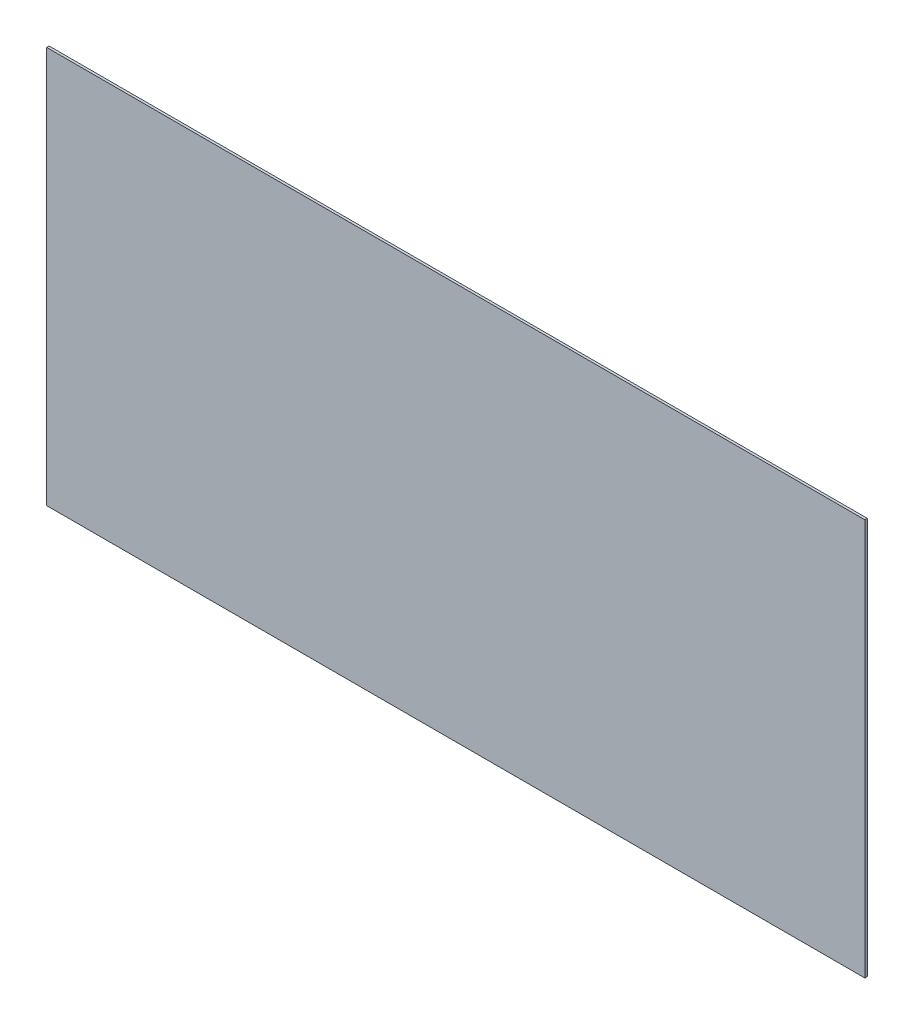
ISO-10303-21;
HEADER;
FILE_DESCRIPTION(('STEP AP214'),'2;1');
FILE_NAME('part.step','',(''),(''),'','','');
FILE_SCHEMA(('AUTOMOTIVE_DESIGN { 1 0 10303 214 1 1 1 1 }'));
ENDSEC;
DATA;
#1=APPLICATION_CONTEXT('core data for automotive mechanical design processes');
#2=APPLICATION_PROTOCOL_DEFINITION('international standard','automotive_design',2000,#1);
#3=PRODUCT_CONTEXT('',#1,'mechanical');
#4=PRODUCT('Part','Part','',(#3));
#5=PRODUCT_RELATED_PRODUCT_CATEGORY('part','',(#4));
#6=PRODUCT_DEFINITION_FORMATION('','',#4);
#7=PRODUCT_DEFINITION_CONTEXT('part definition',#1,'design');
#8=PRODUCT_DEFINITION('design','',#6,#7);
#9=PRODUCT_DEFINITION_SHAPE('','',#8);
#10=(LENGTH_UNIT() NAMED_UNIT(*) SI_UNIT(.MILLI.,.METRE.));
#11=(NAMED_UNIT(*) PLANE_ANGLE_UNIT() SI_UNIT($,.RADIAN.));
#12=(NAMED_UNIT(*) SI_UNIT($,.STERADIAN.) SOLID_ANGLE_UNIT());
#13=UNCERTAINTY_MEASURE_WITH_UNIT(LENGTH_MEASURE(1.E-05),#10,'distance_accuracy_value','');
#14=(GEOMETRIC_REPRESENTATION_CONTEXT(3) GLOBAL_UNCERTAINTY_ASSIGNED_CONTEXT((#13)) GLOBAL_UNIT_ASSIGNED_CONTEXT((#10,
#11,#12)) REPRESENTATION_CONTEXT('',''));
#15=CARTESIAN_POINT('',(0.,0.,0.));
#16=DIRECTION('',(0.,0.,1.));
#17=DIRECTION('',(1.,0.,0.));
#18=AXIS2_PLACEMENT_3D('',#15,#16,#17);
#19=CARTESIAN_POINT('',(-25.5120147874307,6.05914972273569,0.2));
#20=DIRECTION('',(1.,0.,0.));
#21=DIRECTION('',(0.,0.,-1.));
#22=AXIS2_PLACEMENT_3D('',#19,#20,#21);
#23=PLANE('',#22);
#24=DIRECTION('',(0.,-1.,0.));
#25=VECTOR('',#24,1.);
#26=CARTESIAN_POINT('',(-25.5120147874307,6.05914972273569,0.));
#27=LINE('',#26,#25);
#28=CARTESIAN_POINT('',(-25.5120147874307,6.05914972273569,0.));
#29=VERTEX_POINT('',#28);
#30=CARTESIAN_POINT('',(-25.5120147874307,-26.4408502772643,0.));
#31=VERTEX_POINT('',#30);
#32=EDGE_CURVE('E113',#29,#31,#27,.T.);
#33=ORIENTED_EDGE('',*,*,#32,.T.);
#34=DIRECTION('',(0.,0.,-1.));
#35=VECTOR('',#34,1.);
#36=CARTESIAN_POINT('',(-25.5120147874307,-26.4408502772643,0.2));
#37=LINE('',#36,#35);
#38=CARTESIAN_POINT('',(-25.5120147874307,-26.4408502772643,0.2));
#39=VERTEX_POINT('',#38);
#40=EDGE_CURVE('E11',#39,#31,#37,.T.);
#41=ORIENTED_EDGE('',*,*,#40,.F.);
#42=DIRECTION('',(0.,-1.,0.));
#43=VECTOR('',#42,1.);
#44=CARTESIAN_POINT('',(-25.5120147874307,6.05914972273569,0.2));
#45=LINE('',#44,#43);
#46=CARTESIAN_POINT('',(-25.5120147874307,6.05914972273569,0.2));
#47=VERTEX_POINT('',#46);
#48=EDGE_CURVE('E97',#47,#39,#45,.T.);
#49=ORIENTED_EDGE('',*,*,#48,.F.);
#50=DIRECTION('',(0.,0.,-1.));
#51=VECTOR('',#50,1.);
#52=CARTESIAN_POINT('',(-25.5120147874307,6.05914972273569,0.2));
#53=LINE('',#52,#51);
#54=EDGE_CURVE('E109',#47,#29,#53,.T.);
#55=ORIENTED_EDGE('',*,*,#54,.T.);
#56=EDGE_LOOP('',(#33,#41,#49,#55));
#57=FACE_BOUND('',#56,.T.);
#58=ADVANCED_FACE('F45',(#57),#23,.F.);
#59=CARTESIAN_POINT('',(-25.5120147874307,-26.4408502772643,0.2));
#60=DIRECTION('',(0.,1.,0.));
#61=DIRECTION('',(0.,0.,1.));
#62=AXIS2_PLACEMENT_3D('',#59,#60,#61);
#63=PLANE('',#62);
#64=DIRECTION('',(1.,0.,0.));
#65=VECTOR('',#64,1.);
#66=CARTESIAN_POINT('',(-25.5120147874307,-26.4408502772643,0.));
#67=LINE('',#66,#65);
#68=CARTESIAN_POINT('',(41.4879852125693,-26.4408502772643,0.));
#69=VERTEX_POINT('',#68);
#70=EDGE_CURVE('E102',#31,#69,#67,.T.);
#71=ORIENTED_EDGE('',*,*,#70,.T.);
#72=DIRECTION('',(0.,0.,-1.));
#73=VECTOR('',#72,1.);
#74=CARTESIAN_POINT('',(41.4879852125693,-26.4408502772643,0.2));
#75=LINE('',#74,#73);
#76=CARTESIAN_POINT('',(41.4879852125693,-26.4408502772643,0.2));
#77=VERTEX_POINT('',#76);
#78=EDGE_CURVE('E54',#77,#69,#75,.T.);
#79=ORIENTED_EDGE('',*,*,#78,.F.);
#80=DIRECTION('',(1.,0.,0.));
#81=VECTOR('',#80,1.);
#82=CARTESIAN_POINT('',(-25.5120147874307,-26.4408502772643,0.2));
#83=LINE('',#82,#81);
#84=EDGE_CURVE('E92',#39,#77,#83,.T.);
#85=ORIENTED_EDGE('',*,*,#84,.F.);
#86=ORIENTED_EDGE('',*,*,#40,.T.);
#87=EDGE_LOOP('',(#71,#79,#85,#86));
#88=FACE_BOUND('',#87,.T.);
#89=ADVANCED_FACE('F101',(#88),#63,.F.);
#90=CARTESIAN_POINT('',(41.4879852125693,6.05914972273569,0.2));
#91=DIRECTION('',(-1.,0.,0.));
#92=DIRECTION('',(0.,0.,1.));
#93=AXIS2_PLACEMENT_3D('',#90,#91,#92);
#94=PLANE('',#93);
#95=DIRECTION('',(0.,1.,0.));
#96=VECTOR('',#95,1.);
#97=CARTESIAN_POINT('',(41.4879852125693,6.05914972273569,0.));
#98=LINE('',#97,#96);
#99=CARTESIAN_POINT('',(41.4879852125693,6.05914972273569,0.));
#100=VERTEX_POINT('',#99);
#101=EDGE_CURVE('E79',#69,#100,#98,.T.);
#102=ORIENTED_EDGE('',*,*,#101,.T.);
#103=DIRECTION('',(0.,0.,-1.));
#104=VECTOR('',#103,1.);
#105=CARTESIAN_POINT('',(41.4879852125693,6.05914972273569,0.2));
#106=LINE('',#105,#104);
#107=CARTESIAN_POINT('',(41.4879852125693,6.05914972273569,0.2));
#108=VERTEX_POINT('',#107);
#109=EDGE_CURVE('E104',#108,#100,#106,.T.);
#110=ORIENTED_EDGE('',*,*,#109,.F.);
#111=DIRECTION('',(0.,1.,0.));
#112=VECTOR('',#111,1.);
#113=CARTESIAN_POINT('',(41.4879852125693,6.05914972273569,0.2));
#114=LINE('',#113,#112);
#115=EDGE_CURVE('E95',#77,#108,#114,.T.);
#116=ORIENTED_EDGE('',*,*,#115,.F.);
#117=ORIENTED_EDGE('',*,*,#78,.T.);
#118=EDGE_LOOP('',(#102,#110,#116,#117));
#119=FACE_BOUND('',#118,.T.);
#120=ADVANCED_FACE('F105',(#119),#94,.F.);
#121=CARTESIAN_POINT('',(-25.5120147874307,6.05914972273569,0.2));
#122=DIRECTION('',(0.,-1.,0.));
#123=DIRECTION('',(0.,0.,-1.));
#124=AXIS2_PLACEMENT_3D('',#121,#122,#123);
#125=PLANE('',#124);
#126=DIRECTION('',(-1.,0.,0.));
#127=VECTOR('',#126,1.);
#128=CARTESIAN_POINT('',(-25.5120147874307,6.05914972273569,0.));
#129=LINE('',#128,#127);
#130=EDGE_CURVE('E85',#100,#29,#129,.T.);
#131=ORIENTED_EDGE('',*,*,#130,.T.);
#132=ORIENTED_EDGE('',*,*,#54,.F.);
#133=DIRECTION('',(-1.,0.,0.));
#134=VECTOR('',#133,1.);
#135=CARTESIAN_POINT('',(-25.5120147874307,6.05914972273569,0.2));
#136=LINE('',#135,#134);
#137=EDGE_CURVE('E62',#108,#47,#136,.T.);
#138=ORIENTED_EDGE('',*,*,#137,.F.);
#139=ORIENTED_EDGE('',*,*,#109,.T.);
#140=EDGE_LOOP('',(#131,#132,#138,#139));
#141=FACE_BOUND('',#140,.T.);
#142=ADVANCED_FACE('F126',(#141),#125,.F.);
#143=CARTESIAN_POINT('',(0.,0.,0.2));
#144=DIRECTION('',(0.,0.,1.));
#145=DIRECTION('',(1.,0.,0.));
#146=AXIS2_PLACEMENT_3D('',#143,#144,#145);
#147=PLANE('',#146);
#148=ORIENTED_EDGE('',*,*,#48,.T.);
#149=ORIENTED_EDGE('',*,*,#84,.T.);
#150=ORIENTED_EDGE('',*,*,#115,.T.);
#151=ORIENTED_EDGE('',*,*,#137,.T.);
#152=EDGE_LOOP('',(#148,#149,#150,#151));
#153=FACE_BOUND('',#152,.T.);
#154=ADVANCED_FACE('F93',(#153),#147,.T.);
#155=CARTESIAN_POINT('',(0.,0.,0.));
#156=DIRECTION('',(0.,0.,1.));
#157=DIRECTION('',(1.,0.,0.));
#158=AXIS2_PLACEMENT_3D('',#155,#156,#157);
#159=PLANE('',#158);
#160=ORIENTED_EDGE('',*,*,#32,.F.);
#161=ORIENTED_EDGE('',*,*,#130,.F.);
#162=ORIENTED_EDGE('',*,*,#101,.F.);
#163=ORIENTED_EDGE('',*,*,#70,.F.);
#164=EDGE_LOOP('',(#160,#161,#162,#163));
#165=FACE_BOUND('',#164,.T.);
#166=ADVANCED_FACE('F129',(#165),#159,.F.);
#167=CLOSED_SHELL('',(#58,#89,#120,#142,#154,#166));
#168=MANIFOLD_SOLID_BREP('B2',#167);
#169=ADVANCED_BREP_SHAPE_REPRESENTATION('',(#18,#168),#14);
#170=SHAPE_DEFINITION_REPRESENTATION(#9,#169);
ENDSEC;
END-ISO-10303-21;
